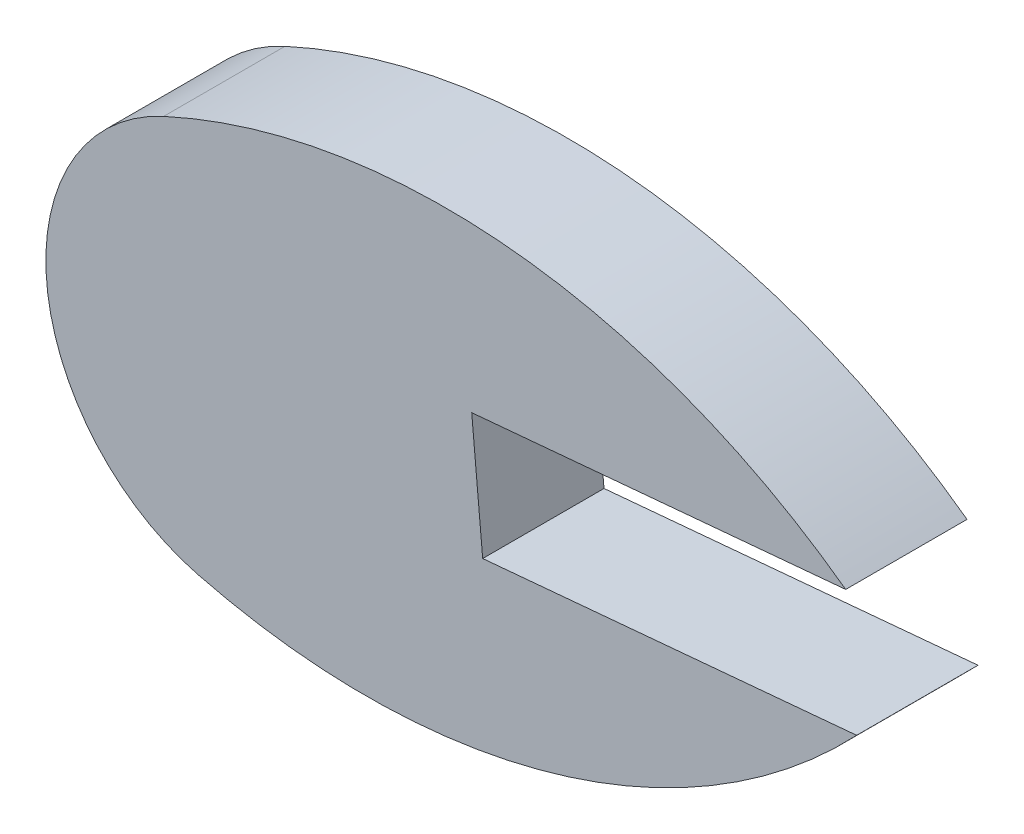
ISO-10303-21;
HEADER;
FILE_DESCRIPTION(('STEP AP214'),'2;1');
FILE_NAME('part.step','',(''),(''),'','','');
FILE_SCHEMA(('AUTOMOTIVE_DESIGN { 1 0 10303 214 1 1 1 1 }'));
ENDSEC;
DATA;
#1=APPLICATION_CONTEXT('core data for automotive mechanical design processes');
#2=APPLICATION_PROTOCOL_DEFINITION('international standard','automotive_design',2000,#1);
#3=PRODUCT_CONTEXT('',#1,'mechanical');
#4=PRODUCT('Part','Part','',(#3));
#5=PRODUCT_RELATED_PRODUCT_CATEGORY('part','',(#4));
#6=PRODUCT_DEFINITION_FORMATION('','',#4);
#7=PRODUCT_DEFINITION_CONTEXT('part definition',#1,'design');
#8=PRODUCT_DEFINITION('design','',#6,#7);
#9=PRODUCT_DEFINITION_SHAPE('','',#8);
#10=(LENGTH_UNIT() NAMED_UNIT(*) SI_UNIT(.MILLI.,.METRE.));
#11=(NAMED_UNIT(*) PLANE_ANGLE_UNIT() SI_UNIT($,.RADIAN.));
#12=(NAMED_UNIT(*) SI_UNIT($,.STERADIAN.) SOLID_ANGLE_UNIT());
#13=UNCERTAINTY_MEASURE_WITH_UNIT(LENGTH_MEASURE(1.E-05),#10,'distance_accuracy_value','');
#14=(GEOMETRIC_REPRESENTATION_CONTEXT(3) GLOBAL_UNCERTAINTY_ASSIGNED_CONTEXT((#13)) GLOBAL_UNIT_ASSIGNED_CONTEXT((#10,
#11,#12)) REPRESENTATION_CONTEXT('',''));
#15=CARTESIAN_POINT('',(0.,0.,0.));
#16=DIRECTION('',(0.,0.,1.));
#17=DIRECTION('',(1.,0.,0.));
#18=AXIS2_PLACEMENT_3D('',#15,#16,#17);
#19=CARTESIAN_POINT('',(-868.617759778355,-21.1363056234507,3.));
#20=DIRECTION('',(0.,0.,-1.));
#21=DIRECTION('',(-1.,0.,0.));
#22=AXIS2_PLACEMENT_3D('',#19,#20,#21);
#23=CYLINDRICAL_SURFACE('',#22,16.7285608448632);
#24=CARTESIAN_POINT('',(-868.617759778355,-21.1363056234507,0.));
#25=DIRECTION('',(0.,0.,1.));
#26=DIRECTION('',(1.,0.,0.));
#27=AXIS2_PLACEMENT_3D('',#24,#25,#26);
#28=CIRCLE('',#27,16.7285608448632);
#29=CARTESIAN_POINT('',(-872.758344406801,-37.3443377950306,0.));
#30=VERTEX_POINT('',#29);
#31=CARTESIAN_POINT('',(-856.474214643547,-32.6419155377134,0.));
#32=VERTEX_POINT('',#31);
#33=EDGE_CURVE('E88',#30,#32,#28,.T.);
#34=ORIENTED_EDGE('',*,*,#33,.T.);
#35=DIRECTION('',(0.,0.,-1.));
#36=VECTOR('',#35,1.);
#37=CARTESIAN_POINT('',(-856.474214643547,-32.6419155377134,3.));
#38=LINE('',#37,#36);
#39=CARTESIAN_POINT('',(-856.474214643547,-32.6419155377134,3.));
#40=VERTEX_POINT('',#39);
#41=EDGE_CURVE('E11',#40,#32,#38,.T.);
#42=ORIENTED_EDGE('',*,*,#41,.F.);
#43=CARTESIAN_POINT('',(-868.617759778355,-21.1363056234507,3.));
#44=DIRECTION('',(0.,0.,1.));
#45=DIRECTION('',(1.,0.,0.));
#46=AXIS2_PLACEMENT_3D('',#43,#44,#45);
#47=CIRCLE('',#46,16.7285608448632);
#48=CARTESIAN_POINT('',(-872.758344406801,-37.3443377950306,3.));
#49=VERTEX_POINT('',#48);
#50=EDGE_CURVE('E111',#49,#40,#47,.T.);
#51=ORIENTED_EDGE('',*,*,#50,.F.);
#52=DIRECTION('',(0.,0.,-1.));
#53=VECTOR('',#52,1.);
#54=CARTESIAN_POINT('',(-872.758344406801,-37.3443377950306,3.));
#55=LINE('',#54,#53);
#56=EDGE_CURVE('E101',#49,#30,#55,.T.);
#57=ORIENTED_EDGE('',*,*,#56,.T.);
#58=EDGE_LOOP('',(#34,#42,#51,#57));
#59=FACE_BOUND('',#58,.T.);
#60=ADVANCED_FACE('F32',(#59),#23,.T.);
#61=CARTESIAN_POINT('',(-856.474214643547,-32.6419155377134,3.));
#62=DIRECTION('',(0.0902919983661421,-0.995915335272556,0.));
#63=DIRECTION('',(0.995915335272556,0.0902919983661421,0.));
#64=AXIS2_PLACEMENT_3D('',#61,#62,#63);
#65=PLANE('',#64);
#66=DIRECTION('',(-0.995915335272556,-0.0902919983661421,0.));
#67=VECTOR('',#66,1.);
#68=CARTESIAN_POINT('',(-856.474214643547,-32.6419155377134,0.));
#69=LINE('',#68,#67);
#70=CARTESIAN_POINT('',(-865.720770196295,-33.4802297490642,0.));
#71=VERTEX_POINT('',#70);
#72=EDGE_CURVE('E84',#32,#71,#69,.T.);
#73=ORIENTED_EDGE('',*,*,#72,.T.);
#74=DIRECTION('',(0.,0.,-1.));
#75=VECTOR('',#74,1.);
#76=CARTESIAN_POINT('',(-865.720770196295,-33.4802297490642,3.));
#77=LINE('',#76,#75);
#78=CARTESIAN_POINT('',(-865.720770196295,-33.4802297490642,3.));
#79=VERTEX_POINT('',#78);
#80=EDGE_CURVE('E39',#79,#71,#77,.T.);
#81=ORIENTED_EDGE('',*,*,#80,.F.);
#82=DIRECTION('',(-0.995915335272556,-0.0902919983661421,0.));
#83=VECTOR('',#82,1.);
#84=CARTESIAN_POINT('',(-856.474214643547,-32.6419155377134,3.));
#85=LINE('',#84,#83);
#86=EDGE_CURVE('E97',#40,#79,#85,.T.);
#87=ORIENTED_EDGE('',*,*,#86,.F.);
#88=ORIENTED_EDGE('',*,*,#41,.T.);
#89=EDGE_LOOP('',(#73,#81,#87,#88));
#90=FACE_BOUND('',#89,.T.);
#91=ADVANCED_FACE('F96',(#90),#65,.F.);
#92=CARTESIAN_POINT('',(-865.991646191394,-30.4924837432465,3.));
#93=DIRECTION('',(-0.995915335272556,-0.0902919983661507,0.));
#94=DIRECTION('',(0.0902919983661507,-0.995915335272556,0.));
#95=AXIS2_PLACEMENT_3D('',#92,#93,#94);
#96=PLANE('',#95);
#97=DIRECTION('',(-0.0902919983661507,0.995915335272556,0.));
#98=VECTOR('',#97,1.);
#99=CARTESIAN_POINT('',(-865.991646191394,-30.4924837432465,0.));
#100=LINE('',#99,#98);
#101=CARTESIAN_POINT('',(-865.991646191394,-30.4924837432465,0.));
#102=VERTEX_POINT('',#101);
#103=EDGE_CURVE('E90',#71,#102,#100,.T.);
#104=ORIENTED_EDGE('',*,*,#103,.T.);
#105=DIRECTION('',(0.,0.,-1.));
#106=VECTOR('',#105,1.);
#107=CARTESIAN_POINT('',(-865.991646191394,-30.4924837432465,3.));
#108=LINE('',#107,#106);
#109=CARTESIAN_POINT('',(-865.991646191394,-30.4924837432465,3.));
#110=VERTEX_POINT('',#109);
#111=EDGE_CURVE('E127',#110,#102,#108,.T.);
#112=ORIENTED_EDGE('',*,*,#111,.F.);
#113=DIRECTION('',(-0.0902919983661507,0.995915335272556,0.));
#114=VECTOR('',#113,1.);
#115=CARTESIAN_POINT('',(-865.991646191394,-30.4924837432465,3.));
#116=LINE('',#115,#114);
#117=EDGE_CURVE('E114',#79,#110,#116,.T.);
#118=ORIENTED_EDGE('',*,*,#117,.F.);
#119=ORIENTED_EDGE('',*,*,#80,.T.);
#120=EDGE_LOOP('',(#104,#112,#118,#119));
#121=FACE_BOUND('',#120,.T.);
#122=ADVANCED_FACE('F131',(#121),#96,.F.);
#123=CARTESIAN_POINT('',(-856.745090638646,-29.6541695318956,3.));
#124=DIRECTION('',(-0.0902919983661599,0.995915335272555,0.));
#125=DIRECTION('',(-0.995915335272555,-0.0902919983661599,0.));
#126=AXIS2_PLACEMENT_3D('',#123,#124,#125);
#127=PLANE('',#126);
#128=DIRECTION('',(0.995915335272555,0.0902919983661599,0.));
#129=VECTOR('',#128,1.);
#130=CARTESIAN_POINT('',(-856.745090638646,-29.6541695318956,0.));
#131=LINE('',#130,#129);
#132=CARTESIAN_POINT('',(-856.745090638646,-29.6541695318956,0.));
#133=VERTEX_POINT('',#132);
#134=EDGE_CURVE('E105',#102,#133,#131,.T.);
#135=ORIENTED_EDGE('',*,*,#134,.T.);
#136=DIRECTION('',(0.,0.,-1.));
#137=VECTOR('',#136,1.);
#138=CARTESIAN_POINT('',(-856.745090638646,-29.6541695318956,3.));
#139=LINE('',#138,#137);
#140=CARTESIAN_POINT('',(-856.745090638646,-29.6541695318956,3.));
#141=VERTEX_POINT('',#140);
#142=EDGE_CURVE('E124',#141,#133,#139,.T.);
#143=ORIENTED_EDGE('',*,*,#142,.F.);
#144=DIRECTION('',(0.995915335272555,0.0902919983661599,0.));
#145=VECTOR('',#144,1.);
#146=CARTESIAN_POINT('',(-856.745090638646,-29.6541695318956,3.));
#147=LINE('',#146,#145);
#148=EDGE_CURVE('E116',#110,#141,#147,.T.);
#149=ORIENTED_EDGE('',*,*,#148,.F.);
#150=ORIENTED_EDGE('',*,*,#111,.T.);
#151=EDGE_LOOP('',(#135,#143,#149,#150));
#152=FACE_BOUND('',#151,.T.);
#153=ADVANCED_FACE('F137',(#152),#127,.F.);
#154=CARTESIAN_POINT('',(-866.62138955245,-43.156149672063,3.));
#155=DIRECTION('',(0.,0.,-1.));
#156=DIRECTION('',(-1.,0.,0.));
#157=AXIS2_PLACEMENT_3D('',#154,#155,#156);
#158=CYLINDRICAL_SURFACE('',#157,16.7285608448632);
#159=CARTESIAN_POINT('',(-866.62138955245,-43.156149672063,0.));
#160=DIRECTION('',(0.,0.,1.));
#161=DIRECTION('',(-1.,0.,0.));
#162=AXIS2_PLACEMENT_3D('',#159,#160,#161);
#163=CIRCLE('',#162,16.7285608448632);
#164=CARTESIAN_POINT('',(-873.609416525671,-27.9570632863017,0.));
#165=VERTEX_POINT('',#164);
#166=EDGE_CURVE('E107',#133,#165,#163,.T.);
#167=ORIENTED_EDGE('',*,*,#166,.T.);
#168=DIRECTION('',(0.,0.,-1.));
#169=VECTOR('',#168,1.);
#170=CARTESIAN_POINT('',(-873.609416525671,-27.9570632863017,3.));
#171=LINE('',#170,#169);
#172=CARTESIAN_POINT('',(-873.609416525671,-27.9570632863017,3.));
#173=VERTEX_POINT('',#172);
#174=EDGE_CURVE('E121',#173,#165,#171,.T.);
#175=ORIENTED_EDGE('',*,*,#174,.F.);
#176=CARTESIAN_POINT('',(-866.62138955245,-43.156149672063,3.));
#177=DIRECTION('',(0.,0.,1.));
#178=DIRECTION('',(-1.,0.,0.));
#179=AXIS2_PLACEMENT_3D('',#176,#177,#178);
#180=CIRCLE('',#179,16.7285608448632);
#181=EDGE_CURVE('E51',#141,#173,#180,.T.);
#182=ORIENTED_EDGE('',*,*,#181,.F.);
#183=ORIENTED_EDGE('',*,*,#142,.T.);
#184=EDGE_LOOP('',(#167,#175,#182,#183));
#185=FACE_BOUND('',#184,.T.);
#186=ADVANCED_FACE('F140',(#185),#158,.T.);
#187=CARTESIAN_POINT('',(-871.520764956051,-32.4999186241619,3.));
#188=DIRECTION('',(0.,0.,-1.));
#189=DIRECTION('',(-1.,0.,0.));
#190=AXIS2_PLACEMENT_3D('',#187,#188,#189);
#191=CYLINDRICAL_SURFACE('',#190,5.);
#192=CARTESIAN_POINT('',(-871.520764956051,-32.4999186241619,0.));
#193=DIRECTION('',(0.,0.,1.));
#194=DIRECTION('',(-1.,0.,0.));
#195=AXIS2_PLACEMENT_3D('',#192,#193,#194);
#196=CIRCLE('',#195,5.);
#197=EDGE_CURVE('E109',#165,#30,#196,.T.);
#198=ORIENTED_EDGE('',*,*,#197,.T.);
#199=ORIENTED_EDGE('',*,*,#56,.F.);
#200=CARTESIAN_POINT('',(-871.520764956051,-32.4999186241619,3.));
#201=DIRECTION('',(0.,0.,1.));
#202=DIRECTION('',(-1.,0.,0.));
#203=AXIS2_PLACEMENT_3D('',#200,#201,#202);
#204=CIRCLE('',#203,5.);
#205=EDGE_CURVE('E46',#173,#49,#204,.T.);
#206=ORIENTED_EDGE('',*,*,#205,.F.);
#207=ORIENTED_EDGE('',*,*,#174,.T.);
#208=EDGE_LOOP('',(#198,#199,#206,#207));
#209=FACE_BOUND('',#208,.T.);
#210=ADVANCED_FACE('F142',(#209),#191,.T.);
#211=CARTESIAN_POINT('',(-868.617759778355,-21.1363056234507,3.));
#212=DIRECTION('',(0.,0.,1.));
#213=DIRECTION('',(1.,0.,0.));
#214=AXIS2_PLACEMENT_3D('',#211,#212,#213);
#215=PLANE('',#214);
#216=ORIENTED_EDGE('',*,*,#50,.T.);
#217=ORIENTED_EDGE('',*,*,#86,.T.);
#218=ORIENTED_EDGE('',*,*,#117,.T.);
#219=ORIENTED_EDGE('',*,*,#148,.T.);
#220=ORIENTED_EDGE('',*,*,#181,.T.);
#221=ORIENTED_EDGE('',*,*,#205,.T.);
#222=EDGE_LOOP('',(#216,#217,#218,#219,#220,#221));
#223=FACE_BOUND('',#222,.T.);
#224=ADVANCED_FACE('F134',(#223),#215,.T.);
#225=CARTESIAN_POINT('',(-868.617759778355,-21.1363056234507,0.));
#226=DIRECTION('',(0.,0.,1.));
#227=DIRECTION('',(1.,0.,0.));
#228=AXIS2_PLACEMENT_3D('',#225,#226,#227);
#229=PLANE('',#228);
#230=ORIENTED_EDGE('',*,*,#33,.F.);
#231=ORIENTED_EDGE('',*,*,#197,.F.);
#232=ORIENTED_EDGE('',*,*,#166,.F.);
#233=ORIENTED_EDGE('',*,*,#134,.F.);
#234=ORIENTED_EDGE('',*,*,#103,.F.);
#235=ORIENTED_EDGE('',*,*,#72,.F.);
#236=EDGE_LOOP('',(#230,#231,#232,#233,#234,#235));
#237=FACE_BOUND('',#236,.T.);
#238=ADVANCED_FACE('F85',(#237),#229,.F.);
#239=CLOSED_SHELL('',(#60,#91,#122,#153,#186,#210,#224,#238));
#240=MANIFOLD_SOLID_BREP('B2',#239);
#241=ADVANCED_BREP_SHAPE_REPRESENTATION('',(#18,#240),#14);
#242=SHAPE_DEFINITION_REPRESENTATION(#9,#241);
ENDSEC;
END-ISO-10303-21;
